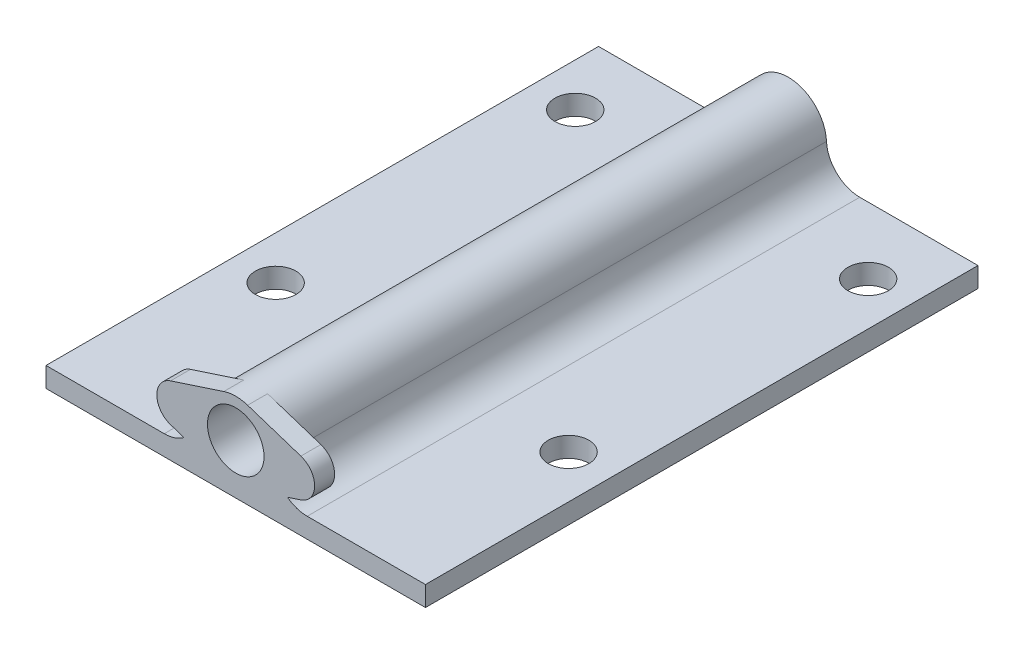
ISO-10303-21;
HEADER;
FILE_DESCRIPTION(('STEP AP214'),'2;1');
FILE_NAME('part.step','',(''),(''),'','','');
FILE_SCHEMA(('AUTOMOTIVE_DESIGN { 1 0 10303 214 1 1 1 1 }'));
ENDSEC;
DATA;
#1=APPLICATION_CONTEXT('core data for automotive mechanical design processes');
#2=APPLICATION_PROTOCOL_DEFINITION('international standard','automotive_design',2000,#1);
#3=PRODUCT_CONTEXT('',#1,'mechanical');
#4=PRODUCT('Part','Part','',(#3));
#5=PRODUCT_RELATED_PRODUCT_CATEGORY('part','',(#4));
#6=PRODUCT_DEFINITION_FORMATION('','',#4);
#7=PRODUCT_DEFINITION_CONTEXT('part definition',#1,'design');
#8=PRODUCT_DEFINITION('design','',#6,#7);
#9=PRODUCT_DEFINITION_SHAPE('','',#8);
#10=(LENGTH_UNIT() NAMED_UNIT(*) SI_UNIT(.MILLI.,.METRE.));
#11=(NAMED_UNIT(*) PLANE_ANGLE_UNIT() SI_UNIT($,.RADIAN.));
#12=(NAMED_UNIT(*) SI_UNIT($,.STERADIAN.) SOLID_ANGLE_UNIT());
#13=UNCERTAINTY_MEASURE_WITH_UNIT(LENGTH_MEASURE(1.E-05),#10,'distance_accuracy_value','');
#14=(GEOMETRIC_REPRESENTATION_CONTEXT(3) GLOBAL_UNCERTAINTY_ASSIGNED_CONTEXT((#13)) GLOBAL_UNIT_ASSIGNED_CONTEXT((#10,
#11,#12)) REPRESENTATION_CONTEXT('',''));
#15=CARTESIAN_POINT('',(0.,0.,0.));
#16=DIRECTION('',(0.,0.,1.));
#17=DIRECTION('',(1.,0.,0.));
#18=AXIS2_PLACEMENT_3D('',#15,#16,#17);
#19=CARTESIAN_POINT('',(0.,0.,1.5));
#20=DIRECTION('',(0.,0.,1.));
#21=DIRECTION('',(1.,0.,0.));
#22=AXIS2_PLACEMENT_3D('',#19,#20,#21);
#23=PLANE('',#22);
#24=CARTESIAN_POINT('',(0.,0.,1.5));
#25=DIRECTION('',(0.,0.,1.));
#26=DIRECTION('',(1.,0.,0.));
#27=AXIS2_PLACEMENT_3D('',#24,#25,#26);
#28=CIRCLE('',#27,4.25);
#29=CARTESIAN_POINT('',(4.25,0.,1.5));
#30=VERTEX_POINT('',#29);
#31=EDGE_CURVE('E282',#30,#30,#28,.F.);
#32=ORIENTED_EDGE('',*,*,#31,.F.);
#33=EDGE_LOOP('',(#32));
#34=FACE_BOUND('',#33,.T.);
#35=ADVANCED_FACE('F43',(#34),#23,.T.);
#36=CARTESIAN_POINT('',(0.,0.,80.));
#37=DIRECTION('',(0.,0.,-1.));
#38=DIRECTION('',(-1.,0.,0.));
#39=AXIS2_PLACEMENT_3D('',#36,#37,#38);
#40=CYLINDRICAL_SURFACE('',#39,4.25);
#41=ORIENTED_EDGE('',*,*,#31,.T.);
#42=EDGE_LOOP('',(#41));
#43=FACE_BOUND('',#42,.T.);
#44=CARTESIAN_POINT('',(0.,0.,83.));
#45=DIRECTION('',(0.,0.,1.));
#46=DIRECTION('',(1.,0.,0.));
#47=AXIS2_PLACEMENT_3D('',#44,#45,#46);
#48=CIRCLE('',#47,4.25);
#49=CARTESIAN_POINT('',(4.25,0.,83.));
#50=VERTEX_POINT('',#49);
#51=EDGE_CURVE('E243',#50,#50,#48,.F.);
#52=ORIENTED_EDGE('',*,*,#51,.F.);
#53=EDGE_LOOP('',(#52));
#54=FACE_BOUND('',#53,.T.);
#55=ADVANCED_FACE('F365',(#43,#54),#40,.F.);
#56=CARTESIAN_POINT('',(0.,0.,80.));
#57=DIRECTION('',(0.,0.,1.));
#58=DIRECTION('',(1.,0.,0.));
#59=AXIS2_PLACEMENT_3D('',#56,#57,#58);
#60=PLANE('',#59);
#61=CARTESIAN_POINT('',(0.,0.,80.));
#62=DIRECTION('',(0.,0.,1.));
#63=DIRECTION('',(1.,0.,0.));
#64=AXIS2_PLACEMENT_3D('',#61,#62,#63);
#65=CIRCLE('',#64,5.75);
#66=CARTESIAN_POINT('',(-1.78589137035897,5.46562823591921,80.));
#67=VERTEX_POINT('',#66);
#68=CARTESIAN_POINT('',(-5.74377705445389,0.267441860465117,80.));
#69=VERTEX_POINT('',#68);
#70=EDGE_CURVE('E279',#67,#69,#65,.T.);
#71=ORIENTED_EDGE('',*,*,#70,.T.);
#72=CARTESIAN_POINT('',(-10.7383657974573,0.5,80.));
#73=DIRECTION('',(0.,0.,1.));
#74=DIRECTION('',(1.,0.,0.));
#75=AXIS2_PLACEMENT_3D('',#72,#73,#74);
#76=CIRCLE('',#75,5.);
#77=CARTESIAN_POINT('',(-7.7576202835554,-3.51436871517227,80.));
#78=VERTEX_POINT('',#77);
#79=EDGE_CURVE('E297',#69,#78,#76,.F.);
#80=ORIENTED_EDGE('',*,*,#79,.T.);
#81=DIRECTION('',(-0.950544041029428,0.310589803540691,0.));
#82=VECTOR('',#81,1.);
#83=CARTESIAN_POINT('',(-1.78589137035897,-5.46562823591921,80.));
#84=LINE('',#83,#82);
#85=CARTESIAN_POINT('',(-9.78589137035897,-2.85163212308828,80.));
#86=VERTEX_POINT('',#85);
#87=EDGE_CURVE('E258',#78,#86,#84,.T.);
#88=ORIENTED_EDGE('',*,*,#87,.T.);
#89=CARTESIAN_POINT('',(-8.8541219597369,0.,80.));
#90=DIRECTION('',(0.,0.,1.));
#91=DIRECTION('',(1.,0.,0.));
#92=AXIS2_PLACEMENT_3D('',#89,#90,#91);
#93=CIRCLE('',#92,3.);
#94=CARTESIAN_POINT('',(-9.78589137035897,2.85163212308828,80.));
#95=VERTEX_POINT('',#94);
#96=EDGE_CURVE('E255',#86,#95,#93,.F.);
#97=ORIENTED_EDGE('',*,*,#96,.T.);
#98=DIRECTION('',(-0.950544041029428,-0.310589803540691,0.));
#99=VECTOR('',#98,1.);
#100=CARTESIAN_POINT('',(-1.78589137035897,5.46562823591921,80.));
#101=LINE('',#100,#99);
#102=EDGE_CURVE('E252',#67,#95,#101,.T.);
#103=ORIENTED_EDGE('',*,*,#102,.F.);
#104=EDGE_LOOP('',(#71,#80,#88,#97,#103));
#105=FACE_BOUND('',#104,.T.);
#106=ADVANCED_FACE('F353',(#105),#60,.F.);
#107=DIRECTION('',(0.950544041029428,0.310589803540691,0.));
#108=VECTOR('',#107,1.);
#109=CARTESIAN_POINT('',(1.78589137035897,-5.46562823591921,80.));
#110=LINE('',#109,#108);
#111=CARTESIAN_POINT('',(7.7576202835554,-3.51436871517227,80.));
#112=VERTEX_POINT('',#111);
#113=CARTESIAN_POINT('',(9.78589137035897,-2.85163212308828,80.));
#114=VERTEX_POINT('',#113);
#115=EDGE_CURVE('E229',#112,#114,#110,.T.);
#116=ORIENTED_EDGE('',*,*,#115,.F.);
#117=CARTESIAN_POINT('',(10.7383657974573,0.5,80.));
#118=DIRECTION('',(0.,0.,1.));
#119=DIRECTION('',(1.,0.,0.));
#120=AXIS2_PLACEMENT_3D('',#117,#118,#119);
#121=CIRCLE('',#120,5.);
#122=CARTESIAN_POINT('',(5.74377705445389,0.267441860465117,80.));
#123=VERTEX_POINT('',#122);
#124=EDGE_CURVE('E295',#112,#123,#121,.F.);
#125=ORIENTED_EDGE('',*,*,#124,.T.);
#126=CARTESIAN_POINT('',(1.78589137035897,5.46562823591921,80.));
#127=VERTEX_POINT('',#126);
#128=EDGE_CURVE('E277',#123,#127,#65,.T.);
#129=ORIENTED_EDGE('',*,*,#128,.T.);
#130=DIRECTION('',(0.950544041029428,-0.310589803540691,0.));
#131=VECTOR('',#130,1.);
#132=CARTESIAN_POINT('',(1.78589137035897,5.46562823591921,80.));
#133=LINE('',#132,#131);
#134=CARTESIAN_POINT('',(9.78589137035897,2.85163212308828,80.));
#135=VERTEX_POINT('',#134);
#136=EDGE_CURVE('E249',#127,#135,#133,.T.);
#137=ORIENTED_EDGE('',*,*,#136,.T.);
#138=CARTESIAN_POINT('',(8.8541219597369,0.,80.));
#139=DIRECTION('',(0.,0.,1.));
#140=DIRECTION('',(1.,0.,0.));
#141=AXIS2_PLACEMENT_3D('',#138,#139,#140);
#142=CIRCLE('',#141,3.);
#143=EDGE_CURVE('E220',#135,#114,#142,.F.);
#144=ORIENTED_EDGE('',*,*,#143,.T.);
#145=EDGE_LOOP('',(#116,#125,#129,#137,#144));
#146=FACE_BOUND('',#145,.T.);
#147=ADVANCED_FACE('F321',(#146),#60,.F.);
#148=CARTESIAN_POINT('',(8.8541219597369,0.,83.));
#149=DIRECTION('',(0.,0.,-1.));
#150=DIRECTION('',(-1.,0.,0.));
#151=AXIS2_PLACEMENT_3D('',#148,#149,#150);
#152=CYLINDRICAL_SURFACE('',#151,3.);
#153=ORIENTED_EDGE('',*,*,#143,.F.);
#154=DIRECTION('',(0.,0.,-1.));
#155=VECTOR('',#154,1.);
#156=CARTESIAN_POINT('',(9.78589137035897,2.85163212308828,83.));
#157=LINE('',#156,#155);
#158=CARTESIAN_POINT('',(9.78589137035897,2.85163212308828,83.));
#159=VERTEX_POINT('',#158);
#160=EDGE_CURVE('E274',#159,#135,#157,.T.);
#161=ORIENTED_EDGE('',*,*,#160,.F.);
#162=CARTESIAN_POINT('',(8.8541219597369,0.,83.));
#163=DIRECTION('',(0.,0.,1.));
#164=DIRECTION('',(1.,0.,0.));
#165=AXIS2_PLACEMENT_3D('',#162,#163,#164);
#166=CIRCLE('',#165,3.);
#167=CARTESIAN_POINT('',(9.78589137035897,-2.85163212308828,83.));
#168=VERTEX_POINT('',#167);
#169=EDGE_CURVE('E225',#159,#168,#166,.F.);
#170=ORIENTED_EDGE('',*,*,#169,.T.);
#171=DIRECTION('',(0.,0.,-1.));
#172=VECTOR('',#171,1.);
#173=CARTESIAN_POINT('',(9.78589137035897,-2.85163212308828,83.));
#174=LINE('',#173,#172);
#175=EDGE_CURVE('E246',#168,#114,#174,.T.);
#176=ORIENTED_EDGE('',*,*,#175,.T.);
#177=EDGE_LOOP('',(#153,#161,#170,#176));
#178=FACE_BOUND('',#177,.T.);
#179=ADVANCED_FACE('F333',(#178),#152,.T.);
#180=CARTESIAN_POINT('',(1.78589137035897,5.46562823591921,83.));
#181=DIRECTION('',(0.310589803540691,0.950544041029428,0.));
#182=DIRECTION('',(-0.950544041029428,0.310589803540691,0.));
#183=AXIS2_PLACEMENT_3D('',#180,#181,#182);
#184=PLANE('',#183);
#185=ORIENTED_EDGE('',*,*,#136,.F.);
#186=DIRECTION('',(0.,0.,-1.));
#187=VECTOR('',#186,1.);
#188=CARTESIAN_POINT('',(1.78589137035897,5.46562823591921,83.));
#189=LINE('',#188,#187);
#190=CARTESIAN_POINT('',(1.78589137035897,5.46562823591921,83.));
#191=VERTEX_POINT('',#190);
#192=EDGE_CURVE('E271',#191,#127,#189,.T.);
#193=ORIENTED_EDGE('',*,*,#192,.F.);
#194=DIRECTION('',(0.950544041029428,-0.310589803540691,0.));
#195=VECTOR('',#194,1.);
#196=CARTESIAN_POINT('',(1.78589137035897,5.46562823591921,83.));
#197=LINE('',#196,#195);
#198=EDGE_CURVE('E228',#191,#159,#197,.T.);
#199=ORIENTED_EDGE('',*,*,#198,.T.);
#200=ORIENTED_EDGE('',*,*,#160,.T.);
#201=EDGE_LOOP('',(#185,#193,#199,#200));
#202=FACE_BOUND('',#201,.T.);
#203=ADVANCED_FACE('F330',(#202),#184,.T.);
#204=CARTESIAN_POINT('',(-1.78589137035897,5.46562823591921,83.));
#205=DIRECTION('',(0.310589803540691,-0.950544041029428,0.));
#206=DIRECTION('',(0.950544041029428,0.310589803540691,0.));
#207=AXIS2_PLACEMENT_3D('',#204,#205,#206);
#208=PLANE('',#207);
#209=ORIENTED_EDGE('',*,*,#102,.T.);
#210=DIRECTION('',(0.,0.,-1.));
#211=VECTOR('',#210,1.);
#212=CARTESIAN_POINT('',(-9.78589137035897,2.85163212308828,83.));
#213=LINE('',#212,#211);
#214=CARTESIAN_POINT('',(-9.78589137035897,2.85163212308828,83.));
#215=VERTEX_POINT('',#214);
#216=EDGE_CURVE('E266',#215,#95,#213,.T.);
#217=ORIENTED_EDGE('',*,*,#216,.F.);
#218=DIRECTION('',(-0.950544041029428,-0.310589803540691,0.));
#219=VECTOR('',#218,1.);
#220=CARTESIAN_POINT('',(-1.78589137035897,5.46562823591921,83.));
#221=LINE('',#220,#219);
#222=CARTESIAN_POINT('',(-1.78589137035897,5.46562823591921,83.));
#223=VERTEX_POINT('',#222);
#224=EDGE_CURVE('E234',#223,#215,#221,.T.);
#225=ORIENTED_EDGE('',*,*,#224,.F.);
#226=DIRECTION('',(0.,0.,-1.));
#227=VECTOR('',#226,1.);
#228=CARTESIAN_POINT('',(-1.78589137035897,5.46562823591921,83.));
#229=LINE('',#228,#227);
#230=EDGE_CURVE('E268',#223,#67,#229,.T.);
#231=ORIENTED_EDGE('',*,*,#230,.T.);
#232=EDGE_LOOP('',(#209,#217,#225,#231));
#233=FACE_BOUND('',#232,.T.);
#234=ADVANCED_FACE('F340',(#233),#208,.F.);
#235=CARTESIAN_POINT('',(-8.8541219597369,0.,83.));
#236=DIRECTION('',(0.,0.,-1.));
#237=DIRECTION('',(-1.,0.,0.));
#238=AXIS2_PLACEMENT_3D('',#235,#236,#237);
#239=CYLINDRICAL_SURFACE('',#238,3.);
#240=ORIENTED_EDGE('',*,*,#96,.F.);
#241=DIRECTION('',(0.,0.,-1.));
#242=VECTOR('',#241,1.);
#243=CARTESIAN_POINT('',(-9.78589137035897,-2.85163212308828,83.));
#244=LINE('',#243,#242);
#245=CARTESIAN_POINT('',(-9.78589137035897,-2.85163212308828,83.));
#246=VERTEX_POINT('',#245);
#247=EDGE_CURVE('E263',#246,#86,#244,.T.);
#248=ORIENTED_EDGE('',*,*,#247,.F.);
#249=CARTESIAN_POINT('',(-8.8541219597369,0.,83.));
#250=DIRECTION('',(0.,0.,1.));
#251=DIRECTION('',(1.,0.,0.));
#252=AXIS2_PLACEMENT_3D('',#249,#250,#251);
#253=CIRCLE('',#252,3.);
#254=EDGE_CURVE('E236',#246,#215,#253,.F.);
#255=ORIENTED_EDGE('',*,*,#254,.T.);
#256=ORIENTED_EDGE('',*,*,#216,.T.);
#257=EDGE_LOOP('',(#240,#248,#255,#256));
#258=FACE_BOUND('',#257,.T.);
#259=ADVANCED_FACE('F344',(#258),#239,.T.);
#260=CARTESIAN_POINT('',(-1.78589137035897,-5.46562823591921,83.));
#261=DIRECTION('',(-0.310589803540691,-0.950544041029428,0.));
#262=DIRECTION('',(0.950544041029428,-0.310589803540691,0.));
#263=AXIS2_PLACEMENT_3D('',#260,#261,#262);
#264=PLANE('',#263);
#265=ORIENTED_EDGE('',*,*,#87,.F.);
#266=DIRECTION('',(0.,0.,-1.));
#267=VECTOR('',#266,1.);
#268=CARTESIAN_POINT('',(-7.7576202835554,-3.51436871517227,80.));
#269=LINE('',#268,#267);
#270=CARTESIAN_POINT('',(-7.7576202835554,-3.51436871517227,83.));
#271=VERTEX_POINT('',#270);
#272=EDGE_CURVE('E299',#78,#271,#269,.F.);
#273=ORIENTED_EDGE('',*,*,#272,.T.);
#274=DIRECTION('',(-0.950544041029428,0.310589803540691,0.));
#275=VECTOR('',#274,1.);
#276=CARTESIAN_POINT('',(-1.78589137035897,-5.46562823591921,83.));
#277=LINE('',#276,#275);
#278=EDGE_CURVE('E239',#271,#246,#277,.T.);
#279=ORIENTED_EDGE('',*,*,#278,.T.);
#280=ORIENTED_EDGE('',*,*,#247,.T.);
#281=EDGE_LOOP('',(#265,#273,#279,#280));
#282=FACE_BOUND('',#281,.T.);
#283=ADVANCED_FACE('F355',(#282),#264,.T.);
#284=CARTESIAN_POINT('',(1.78589137035897,-5.46562823591921,83.));
#285=DIRECTION('',(-0.310589803540691,0.950544041029428,0.));
#286=DIRECTION('',(-0.950544041029428,-0.310589803540691,0.));
#287=AXIS2_PLACEMENT_3D('',#284,#285,#286);
#288=PLANE('',#287);
#289=DIRECTION('',(0.950544041029428,0.310589803540691,0.));
#290=VECTOR('',#289,1.);
#291=CARTESIAN_POINT('',(1.78589137035897,-5.46562823591921,83.));
#292=LINE('',#291,#290);
#293=CARTESIAN_POINT('',(7.7576202835554,-3.51436871517227,83.));
#294=VERTEX_POINT('',#293);
#295=EDGE_CURVE('E241',#294,#168,#292,.T.);
#296=ORIENTED_EDGE('',*,*,#295,.F.);
#297=DIRECTION('',(0.,0.,-1.));
#298=VECTOR('',#297,1.);
#299=CARTESIAN_POINT('',(7.75762028355539,-3.51436871517227,83.));
#300=LINE('',#299,#298);
#301=EDGE_CURVE('E293',#294,#112,#300,.T.);
#302=ORIENTED_EDGE('',*,*,#301,.T.);
#303=ORIENTED_EDGE('',*,*,#115,.T.);
#304=ORIENTED_EDGE('',*,*,#175,.F.);
#305=EDGE_LOOP('',(#296,#302,#303,#304));
#306=FACE_BOUND('',#305,.T.);
#307=ADVANCED_FACE('F314',(#306),#288,.F.);
#308=CARTESIAN_POINT('',(0.,0.,83.));
#309=DIRECTION('',(0.,0.,1.));
#310=DIRECTION('',(1.,0.,0.));
#311=AXIS2_PLACEMENT_3D('',#308,#309,#310);
#312=PLANE('',#311);
#313=ORIENTED_EDGE('',*,*,#278,.F.);
#314=CARTESIAN_POINT('',(-10.7383657974573,0.5,83.));
#315=DIRECTION('',(0.,0.,1.));
#316=DIRECTION('',(1.,0.,0.));
#317=AXIS2_PLACEMENT_3D('',#314,#315,#316);
#318=CIRCLE('',#317,5.);
#319=CARTESIAN_POINT('',(-10.7383657974573,-4.5,83.));
#320=VERTEX_POINT('',#319);
#321=EDGE_CURVE('E51',#271,#320,#318,.F.);
#322=ORIENTED_EDGE('',*,*,#321,.T.);
#323=DIRECTION('',(1.,0.,0.));
#324=VECTOR('',#323,1.);
#325=CARTESIAN_POINT('',(0.,-4.5,83.));
#326=LINE('',#325,#324);
#327=CARTESIAN_POINT('',(-28.5,-4.5,83.));
#328=VERTEX_POINT('',#327);
#329=EDGE_CURVE('E161',#328,#320,#326,.T.);
#330=ORIENTED_EDGE('',*,*,#329,.F.);
#331=DIRECTION('',(0.,1.,0.));
#332=VECTOR('',#331,1.);
#333=CARTESIAN_POINT('',(-28.5,-7.5,83.));
#334=LINE('',#333,#332);
#335=CARTESIAN_POINT('',(-28.5,-7.5,83.));
#336=VERTEX_POINT('',#335);
#337=EDGE_CURVE('E155',#336,#328,#334,.T.);
#338=ORIENTED_EDGE('',*,*,#337,.F.);
#339=DIRECTION('',(1.,0.,0.));
#340=VECTOR('',#339,1.);
#341=CARTESIAN_POINT('',(0.,-7.5,83.));
#342=LINE('',#341,#340);
#343=CARTESIAN_POINT('',(28.5,-7.5,83.));
#344=VERTEX_POINT('',#343);
#345=EDGE_CURVE('E160',#336,#344,#342,.T.);
#346=ORIENTED_EDGE('',*,*,#345,.T.);
#347=DIRECTION('',(0.,1.,0.));
#348=VECTOR('',#347,1.);
#349=CARTESIAN_POINT('',(28.5,-7.5,83.));
#350=LINE('',#349,#348);
#351=CARTESIAN_POINT('',(28.5,-4.5,83.));
#352=VERTEX_POINT('',#351);
#353=EDGE_CURVE('E166',#344,#352,#350,.T.);
#354=ORIENTED_EDGE('',*,*,#353,.T.);
#355=CARTESIAN_POINT('',(10.7383657974573,-4.5,83.));
#356=VERTEX_POINT('',#355);
#357=EDGE_CURVE('E203',#356,#352,#326,.T.);
#358=ORIENTED_EDGE('',*,*,#357,.F.);
#359=CARTESIAN_POINT('',(10.7383657974573,0.5,83.));
#360=DIRECTION('',(0.,0.,1.));
#361=DIRECTION('',(1.,0.,0.));
#362=AXIS2_PLACEMENT_3D('',#359,#360,#361);
#363=CIRCLE('',#362,5.);
#364=EDGE_CURVE('E304',#356,#294,#363,.F.);
#365=ORIENTED_EDGE('',*,*,#364,.T.);
#366=ORIENTED_EDGE('',*,*,#295,.T.);
#367=ORIENTED_EDGE('',*,*,#169,.F.);
#368=ORIENTED_EDGE('',*,*,#198,.F.);
#369=CARTESIAN_POINT('',(0.,0.,83.));
#370=DIRECTION('',(0.,0.,1.));
#371=DIRECTION('',(1.,0.,0.));
#372=AXIS2_PLACEMENT_3D('',#369,#370,#371);
#373=CIRCLE('',#372,5.75);
#374=EDGE_CURVE('E232',#191,#223,#373,.T.);
#375=ORIENTED_EDGE('',*,*,#374,.T.);
#376=ORIENTED_EDGE('',*,*,#224,.T.);
#377=ORIENTED_EDGE('',*,*,#254,.F.);
#378=EDGE_LOOP('',(#313,#322,#330,#338,#346,#354,#358,#365,#366,#367,#368,#375,#376,#377));
#379=FACE_BOUND('',#378,.T.);
#380=ORIENTED_EDGE('',*,*,#51,.T.);
#381=EDGE_LOOP('',(#380));
#382=FACE_BOUND('',#381,.T.);
#383=ADVANCED_FACE('F157',(#379,#382),#312,.T.);
#384=CARTESIAN_POINT('',(0.,0.,0.));
#385=DIRECTION('',(0.,0.,1.));
#386=DIRECTION('',(1.,0.,0.));
#387=AXIS2_PLACEMENT_3D('',#384,#385,#386);
#388=PLANE('',#387);
#389=CARTESIAN_POINT('',(0.,0.,0.));
#390=DIRECTION('',(0.,0.,1.));
#391=DIRECTION('',(1.,0.,0.));
#392=AXIS2_PLACEMENT_3D('',#389,#390,#391);
#393=CIRCLE('',#392,5.75);
#394=CARTESIAN_POINT('',(5.74377705445389,0.267441860465117,0.));
#395=VERTEX_POINT('',#394);
#396=CARTESIAN_POINT('',(-5.74377705445389,0.267441860465117,0.));
#397=VERTEX_POINT('',#396);
#398=EDGE_CURVE('E276',#395,#397,#393,.T.);
#399=ORIENTED_EDGE('',*,*,#398,.F.);
#400=CARTESIAN_POINT('',(10.7383657974573,0.5,0.));
#401=DIRECTION('',(0.,0.,1.));
#402=DIRECTION('',(1.,0.,0.));
#403=AXIS2_PLACEMENT_3D('',#400,#401,#402);
#404=CIRCLE('',#403,5.);
#405=CARTESIAN_POINT('',(10.7383657974573,-4.5,0.));
#406=VERTEX_POINT('',#405);
#407=EDGE_CURVE('E302',#395,#406,#404,.T.);
#408=ORIENTED_EDGE('',*,*,#407,.T.);
#409=DIRECTION('',(1.,0.,0.));
#410=VECTOR('',#409,1.);
#411=CARTESIAN_POINT('',(0.,-4.5,0.));
#412=LINE('',#411,#410);
#413=CARTESIAN_POINT('',(28.4999999999999,-4.5,0.));
#414=VERTEX_POINT('',#413);
#415=EDGE_CURVE('E208',#406,#414,#412,.T.);
#416=ORIENTED_EDGE('',*,*,#415,.T.);
#417=DIRECTION('',(0.,1.,0.));
#418=VECTOR('',#417,1.);
#419=CARTESIAN_POINT('',(28.4999999999999,-7.5,0.));
#420=LINE('',#419,#418);
#421=CARTESIAN_POINT('',(28.4999999999999,-7.5,0.));
#422=VERTEX_POINT('',#421);
#423=EDGE_CURVE('E221',#422,#414,#420,.T.);
#424=ORIENTED_EDGE('',*,*,#423,.F.);
#425=DIRECTION('',(1.,0.,0.));
#426=VECTOR('',#425,1.);
#427=CARTESIAN_POINT('',(0.,-7.5,0.));
#428=LINE('',#427,#426);
#429=CARTESIAN_POINT('',(-28.4999999999999,-7.5,0.));
#430=VERTEX_POINT('',#429);
#431=EDGE_CURVE('E188',#430,#422,#428,.T.);
#432=ORIENTED_EDGE('',*,*,#431,.F.);
#433=DIRECTION('',(0.,1.,0.));
#434=VECTOR('',#433,1.);
#435=CARTESIAN_POINT('',(-28.4999999999999,-7.5,0.));
#436=LINE('',#435,#434);
#437=CARTESIAN_POINT('',(-28.4999999999999,-4.5,0.));
#438=VERTEX_POINT('',#437);
#439=EDGE_CURVE('E179',#430,#438,#436,.T.);
#440=ORIENTED_EDGE('',*,*,#439,.T.);
#441=CARTESIAN_POINT('',(-10.7383657974573,-4.5,0.));
#442=VERTEX_POINT('',#441);
#443=EDGE_CURVE('E209',#438,#442,#412,.T.);
#444=ORIENTED_EDGE('',*,*,#443,.T.);
#445=CARTESIAN_POINT('',(-10.7383657974573,0.5,0.));
#446=DIRECTION('',(0.,0.,1.));
#447=DIRECTION('',(1.,0.,0.));
#448=AXIS2_PLACEMENT_3D('',#445,#446,#447);
#449=CIRCLE('',#448,5.);
#450=EDGE_CURVE('E12',#442,#397,#449,.T.);
#451=ORIENTED_EDGE('',*,*,#450,.T.);
#452=EDGE_LOOP('',(#399,#408,#416,#424,#432,#440,#444,#451));
#453=FACE_BOUND('',#452,.T.);
#454=ADVANCED_FACE('F351',(#453),#388,.F.);
#455=CARTESIAN_POINT('',(0.,0.,80.));
#456=DIRECTION('',(0.,0.,-1.));
#457=DIRECTION('',(-1.,0.,0.));
#458=AXIS2_PLACEMENT_3D('',#455,#456,#457);
#459=CYLINDRICAL_SURFACE('',#458,5.75);
#460=ORIENTED_EDGE('',*,*,#128,.F.);
#461=DIRECTION('',(0.,0.,-1.));
#462=VECTOR('',#461,1.);
#463=CARTESIAN_POINT('',(5.74377705445389,0.267441860465117,80.));
#464=LINE('',#463,#462);
#465=EDGE_CURVE('E288',#123,#395,#464,.T.);
#466=ORIENTED_EDGE('',*,*,#465,.T.);
#467=ORIENTED_EDGE('',*,*,#398,.T.);
#468=DIRECTION('',(0.,0.,-1.));
#469=VECTOR('',#468,1.);
#470=CARTESIAN_POINT('',(-5.74377705445389,0.267441860465117,80.));
#471=LINE('',#470,#469);
#472=EDGE_CURVE('E285',#397,#69,#471,.F.);
#473=ORIENTED_EDGE('',*,*,#472,.T.);
#474=ORIENTED_EDGE('',*,*,#70,.F.);
#475=ORIENTED_EDGE('',*,*,#230,.F.);
#476=ORIENTED_EDGE('',*,*,#374,.F.);
#477=ORIENTED_EDGE('',*,*,#192,.T.);
#478=EDGE_LOOP('',(#460,#466,#467,#473,#474,#475,#476,#477));
#479=FACE_BOUND('',#478,.T.);
#480=ADVANCED_FACE('F323',(#479),#459,.T.);
#481=CARTESIAN_POINT('',(0.,-4.5,0.));
#482=DIRECTION('',(0.,1.,0.));
#483=DIRECTION('',(0.,0.,1.));
#484=AXIS2_PLACEMENT_3D('',#481,#482,#483);
#485=PLANE('',#484);
#486=CARTESIAN_POINT('',(21.9999999999995,-4.5,55.));
#487=DIRECTION('',(0.,1.,0.));
#488=DIRECTION('',(0.,0.,1.));
#489=AXIS2_PLACEMENT_3D('',#486,#487,#488);
#490=CIRCLE('',#489,3.05);
#491=CARTESIAN_POINT('',(21.9999999999995,-4.5,58.05));
#492=VERTEX_POINT('',#491);
#493=EDGE_CURVE('E211',#492,#492,#490,.F.);
#494=ORIENTED_EDGE('',*,*,#493,.T.);
#495=EDGE_LOOP('',(#494));
#496=FACE_BOUND('',#495,.T.);
#497=CARTESIAN_POINT('',(21.9999999999999,-4.5,10.));
#498=DIRECTION('',(0.,1.,0.));
#499=DIRECTION('',(0.,0.,1.));
#500=AXIS2_PLACEMENT_3D('',#497,#498,#499);
#501=CIRCLE('',#500,3.05);
#502=CARTESIAN_POINT('',(21.9999999999999,-4.5,13.05));
#503=VERTEX_POINT('',#502);
#504=EDGE_CURVE('E214',#503,#503,#501,.F.);
#505=ORIENTED_EDGE('',*,*,#504,.T.);
#506=EDGE_LOOP('',(#505));
#507=FACE_BOUND('',#506,.T.);
#508=ORIENTED_EDGE('',*,*,#415,.F.);
#509=DIRECTION('',(0.,0.,-1.));
#510=VECTOR('',#509,1.);
#511=CARTESIAN_POINT('',(10.7383657974573,-4.5,0.));
#512=LINE('',#511,#510);
#513=EDGE_CURVE('E291',#406,#356,#512,.F.);
#514=ORIENTED_EDGE('',*,*,#513,.T.);
#515=ORIENTED_EDGE('',*,*,#357,.T.);
#516=DIRECTION('',(0.,0.,1.));
#517=VECTOR('',#516,1.);
#518=CARTESIAN_POINT('',(28.4999999999999,-4.5,0.));
#519=LINE('',#518,#517);
#520=EDGE_CURVE('E205',#414,#352,#519,.T.);
#521=ORIENTED_EDGE('',*,*,#520,.F.);
#522=EDGE_LOOP('',(#508,#514,#515,#521));
#523=FACE_BOUND('',#522,.T.);
#524=ADVANCED_FACE('F384',(#496,#507,#523),#485,.T.);
#525=CARTESIAN_POINT('',(-28.4999999999999,-7.5,0.));
#526=DIRECTION('',(-1.,0.,0.));
#527=DIRECTION('',(0.,0.,1.));
#528=AXIS2_PLACEMENT_3D('',#525,#526,#527);
#529=PLANE('',#528);
#530=DIRECTION('',(0.,0.,1.));
#531=VECTOR('',#530,1.);
#532=CARTESIAN_POINT('',(-28.4999999999999,-4.5,0.));
#533=LINE('',#532,#531);
#534=EDGE_CURVE('E201',#438,#328,#533,.T.);
#535=ORIENTED_EDGE('',*,*,#534,.F.);
#536=ORIENTED_EDGE('',*,*,#439,.F.);
#537=DIRECTION('',(0.,0.,1.));
#538=VECTOR('',#537,1.);
#539=CARTESIAN_POINT('',(-28.4999999999999,-7.5,0.));
#540=LINE('',#539,#538);
#541=EDGE_CURVE('E173',#430,#336,#540,.T.);
#542=ORIENTED_EDGE('',*,*,#541,.T.);
#543=ORIENTED_EDGE('',*,*,#337,.T.);
#544=EDGE_LOOP('',(#535,#536,#542,#543));
#545=FACE_BOUND('',#544,.T.);
#546=ADVANCED_FACE('F178',(#545),#529,.T.);
#547=CARTESIAN_POINT('',(28.4999999999999,-7.5,0.));
#548=DIRECTION('',(-1.,0.,0.));
#549=DIRECTION('',(0.,0.,1.));
#550=AXIS2_PLACEMENT_3D('',#547,#548,#549);
#551=PLANE('',#550);
#552=ORIENTED_EDGE('',*,*,#520,.T.);
#553=ORIENTED_EDGE('',*,*,#353,.F.);
#554=DIRECTION('',(0.,0.,1.));
#555=VECTOR('',#554,1.);
#556=CARTESIAN_POINT('',(28.4999999999999,-7.5,0.));
#557=LINE('',#556,#555);
#558=EDGE_CURVE('E175',#422,#344,#557,.T.);
#559=ORIENTED_EDGE('',*,*,#558,.F.);
#560=ORIENTED_EDGE('',*,*,#423,.T.);
#561=EDGE_LOOP('',(#552,#553,#559,#560));
#562=FACE_BOUND('',#561,.T.);
#563=ADVANCED_FACE('F398',(#562),#551,.F.);
#564=CARTESIAN_POINT('',(-21.9999999999995,-7.5,55.));
#565=DIRECTION('',(0.,1.,0.));
#566=DIRECTION('',(0.,0.,1.));
#567=AXIS2_PLACEMENT_3D('',#564,#565,#566);
#568=CYLINDRICAL_SURFACE('',#567,3.05);
#569=CARTESIAN_POINT('',(-21.9999999999995,-7.5,55.));
#570=DIRECTION('',(0.,1.,0.));
#571=DIRECTION('',(0.,0.,1.));
#572=AXIS2_PLACEMENT_3D('',#569,#570,#571);
#573=CIRCLE('',#572,3.05);
#574=CARTESIAN_POINT('',(-21.9999999999995,-7.5,58.05));
#575=VERTEX_POINT('',#574);
#576=EDGE_CURVE('E196',#575,#575,#573,.T.);
#577=ORIENTED_EDGE('',*,*,#576,.F.);
#578=EDGE_LOOP('',(#577));
#579=FACE_BOUND('',#578,.T.);
#580=CARTESIAN_POINT('',(-21.9999999999995,-4.5,55.));
#581=DIRECTION('',(0.,1.,0.));
#582=DIRECTION('',(0.,0.,1.));
#583=AXIS2_PLACEMENT_3D('',#580,#581,#582);
#584=CIRCLE('',#583,3.05);
#585=CARTESIAN_POINT('',(-21.9999999999995,-4.5,58.05));
#586=VERTEX_POINT('',#585);
#587=EDGE_CURVE('E184',#586,#586,#584,.T.);
#588=ORIENTED_EDGE('',*,*,#587,.T.);
#589=EDGE_LOOP('',(#588));
#590=FACE_BOUND('',#589,.T.);
#591=ADVANCED_FACE('F409',(#579,#590),#568,.F.);
#592=CARTESIAN_POINT('',(21.9999999999999,-7.5,10.));
#593=DIRECTION('',(0.,1.,0.));
#594=DIRECTION('',(0.,0.,1.));
#595=AXIS2_PLACEMENT_3D('',#592,#593,#594);
#596=CYLINDRICAL_SURFACE('',#595,3.05);
#597=CARTESIAN_POINT('',(21.9999999999999,-7.5,10.));
#598=DIRECTION('',(0.,1.,0.));
#599=DIRECTION('',(0.,0.,1.));
#600=AXIS2_PLACEMENT_3D('',#597,#598,#599);
#601=CIRCLE('',#600,3.05);
#602=CARTESIAN_POINT('',(21.9999999999999,-7.5,13.05));
#603=VERTEX_POINT('',#602);
#604=EDGE_CURVE('E193',#603,#603,#601,.F.);
#605=ORIENTED_EDGE('',*,*,#604,.T.);
#606=EDGE_LOOP('',(#605));
#607=FACE_BOUND('',#606,.T.);
#608=ORIENTED_EDGE('',*,*,#504,.F.);
#609=EDGE_LOOP('',(#608));
#610=FACE_BOUND('',#609,.T.);
#611=ADVANCED_FACE('F414',(#607,#610),#596,.F.);
#612=CARTESIAN_POINT('',(21.9999999999995,-7.5,55.));
#613=DIRECTION('',(0.,1.,0.));
#614=DIRECTION('',(0.,0.,1.));
#615=AXIS2_PLACEMENT_3D('',#612,#613,#614);
#616=CYLINDRICAL_SURFACE('',#615,3.05);
#617=CARTESIAN_POINT('',(21.9999999999995,-7.5,55.));
#618=DIRECTION('',(0.,1.,0.));
#619=DIRECTION('',(0.,0.,1.));
#620=AXIS2_PLACEMENT_3D('',#617,#618,#619);
#621=CIRCLE('',#620,3.05);
#622=CARTESIAN_POINT('',(21.9999999999995,-7.5,58.05));
#623=VERTEX_POINT('',#622);
#624=EDGE_CURVE('E190',#623,#623,#621,.F.);
#625=ORIENTED_EDGE('',*,*,#624,.T.);
#626=EDGE_LOOP('',(#625));
#627=FACE_BOUND('',#626,.T.);
#628=ORIENTED_EDGE('',*,*,#493,.F.);
#629=EDGE_LOOP('',(#628));
#630=FACE_BOUND('',#629,.T.);
#631=ADVANCED_FACE('F418',(#627,#630),#616,.F.);
#632=CARTESIAN_POINT('',(-21.9999999999999,-7.5,10.));
#633=DIRECTION('',(0.,1.,0.));
#634=DIRECTION('',(0.,0.,1.));
#635=AXIS2_PLACEMENT_3D('',#632,#633,#634);
#636=CYLINDRICAL_SURFACE('',#635,3.05);
#637=CARTESIAN_POINT('',(-21.9999999999999,-7.5,10.));
#638=DIRECTION('',(0.,1.,0.));
#639=DIRECTION('',(0.,0.,1.));
#640=AXIS2_PLACEMENT_3D('',#637,#638,#639);
#641=CIRCLE('',#640,3.05);
#642=CARTESIAN_POINT('',(-21.9999999999999,-7.5,13.05));
#643=VERTEX_POINT('',#642);
#644=EDGE_CURVE('E167',#643,#643,#641,.T.);
#645=ORIENTED_EDGE('',*,*,#644,.F.);
#646=EDGE_LOOP('',(#645));
#647=FACE_BOUND('',#646,.T.);
#648=CARTESIAN_POINT('',(-21.9999999999999,-4.5,10.));
#649=DIRECTION('',(0.,1.,0.));
#650=DIRECTION('',(0.,0.,1.));
#651=AXIS2_PLACEMENT_3D('',#648,#649,#650);
#652=CIRCLE('',#651,3.05);
#653=CARTESIAN_POINT('',(-21.9999999999999,-4.5,13.05));
#654=VERTEX_POINT('',#653);
#655=EDGE_CURVE('E181',#654,#654,#652,.T.);
#656=ORIENTED_EDGE('',*,*,#655,.T.);
#657=EDGE_LOOP('',(#656));
#658=FACE_BOUND('',#657,.T.);
#659=ADVANCED_FACE('F388',(#647,#658),#636,.F.);
#660=CARTESIAN_POINT('',(0.,-7.5,0.));
#661=DIRECTION('',(0.,1.,0.));
#662=DIRECTION('',(0.,0.,1.));
#663=AXIS2_PLACEMENT_3D('',#660,#661,#662);
#664=PLANE('',#663);
#665=ORIENTED_EDGE('',*,*,#541,.F.);
#666=ORIENTED_EDGE('',*,*,#431,.T.);
#667=ORIENTED_EDGE('',*,*,#558,.T.);
#668=ORIENTED_EDGE('',*,*,#345,.F.);
#669=EDGE_LOOP('',(#665,#666,#667,#668));
#670=FACE_BOUND('',#669,.T.);
#671=ORIENTED_EDGE('',*,*,#624,.F.);
#672=EDGE_LOOP('',(#671));
#673=FACE_BOUND('',#672,.T.);
#674=ORIENTED_EDGE('',*,*,#604,.F.);
#675=EDGE_LOOP('',(#674));
#676=FACE_BOUND('',#675,.T.);
#677=ORIENTED_EDGE('',*,*,#576,.T.);
#678=EDGE_LOOP('',(#677));
#679=FACE_BOUND('',#678,.T.);
#680=ORIENTED_EDGE('',*,*,#644,.T.);
#681=EDGE_LOOP('',(#680));
#682=FACE_BOUND('',#681,.T.);
#683=ADVANCED_FACE('F171',(#670,#673,#676,#679,#682),#664,.F.);
#684=ORIENTED_EDGE('',*,*,#329,.T.);
#685=DIRECTION('',(0.,0.,-1.));
#686=VECTOR('',#685,1.);
#687=CARTESIAN_POINT('',(-10.7383657974573,-4.5,0.));
#688=LINE('',#687,#686);
#689=EDGE_CURVE('E58',#320,#442,#688,.T.);
#690=ORIENTED_EDGE('',*,*,#689,.T.);
#691=ORIENTED_EDGE('',*,*,#443,.F.);
#692=ORIENTED_EDGE('',*,*,#534,.T.);
#693=EDGE_LOOP('',(#684,#690,#691,#692));
#694=FACE_BOUND('',#693,.T.);
#695=ORIENTED_EDGE('',*,*,#587,.F.);
#696=EDGE_LOOP('',(#695));
#697=FACE_BOUND('',#696,.T.);
#698=ORIENTED_EDGE('',*,*,#655,.F.);
#699=EDGE_LOOP('',(#698));
#700=FACE_BOUND('',#699,.T.);
#701=ADVANCED_FACE('F378',(#694,#697,#700),#485,.T.);
#702=CARTESIAN_POINT('',(10.7383657974573,0.5,80.));
#703=DIRECTION('',(0.,0.,-1.));
#704=DIRECTION('',(-1.,0.,0.));
#705=AXIS2_PLACEMENT_3D('',#702,#703,#704);
#706=CYLINDRICAL_SURFACE('',#705,5.);
#707=ORIENTED_EDGE('',*,*,#364,.F.);
#708=ORIENTED_EDGE('',*,*,#513,.F.);
#709=ORIENTED_EDGE('',*,*,#407,.F.);
#710=ORIENTED_EDGE('',*,*,#465,.F.);
#711=ORIENTED_EDGE('',*,*,#124,.F.);
#712=ORIENTED_EDGE('',*,*,#301,.F.);
#713=EDGE_LOOP('',(#707,#708,#709,#710,#711,#712));
#714=FACE_BOUND('',#713,.T.);
#715=ADVANCED_FACE('F317',(#714),#706,.F.);
#716=CARTESIAN_POINT('',(-10.7383657974573,0.5,80.));
#717=DIRECTION('',(0.,0.,-1.));
#718=DIRECTION('',(-1.,0.,0.));
#719=AXIS2_PLACEMENT_3D('',#716,#717,#718);
#720=CYLINDRICAL_SURFACE('',#719,5.);
#721=ORIENTED_EDGE('',*,*,#450,.F.);
#722=ORIENTED_EDGE('',*,*,#689,.F.);
#723=ORIENTED_EDGE('',*,*,#321,.F.);
#724=ORIENTED_EDGE('',*,*,#272,.F.);
#725=ORIENTED_EDGE('',*,*,#79,.F.);
#726=ORIENTED_EDGE('',*,*,#472,.F.);
#727=EDGE_LOOP('',(#721,#722,#723,#724,#725,#726));
#728=FACE_BOUND('',#727,.T.);
#729=ADVANCED_FACE('F45',(#728),#720,.F.);
#730=CLOSED_SHELL('',(#35,#55,#106,#147,#179,#203,#234,#259,#283,#307,#383,#454,#480,#524,#546,
#563,#591,#611,#631,#659,#683,#701,#715,#729));
#731=MANIFOLD_SOLID_BREP('B2',#730);
#732=ADVANCED_BREP_SHAPE_REPRESENTATION('',(#18,#731),#14);
#733=SHAPE_DEFINITION_REPRESENTATION(#9,#732);
ENDSEC;
END-ISO-10303-21;
